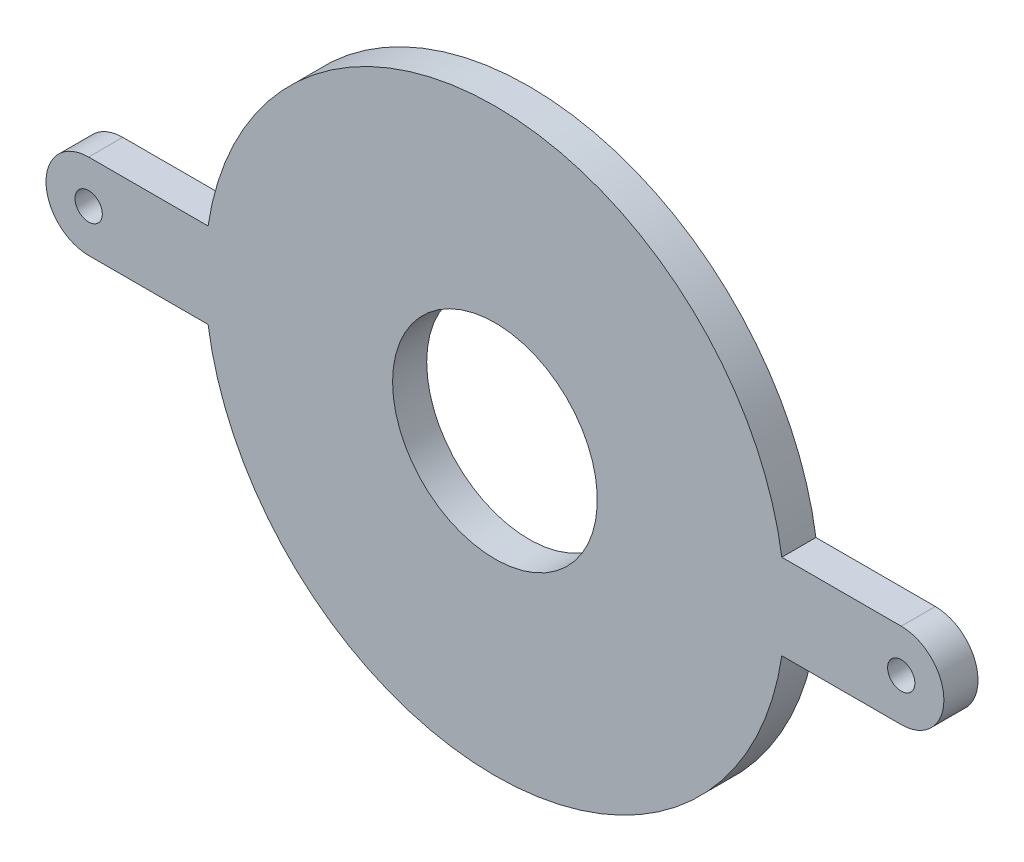
ISO-10303-21;
HEADER;
FILE_DESCRIPTION(('STEP AP214'),'2;1');
FILE_NAME('part.step','',(''),(''),'','','');
FILE_SCHEMA(('AUTOMOTIVE_DESIGN { 1 0 10303 214 1 1 1 1 }'));
ENDSEC;
DATA;
#1=APPLICATION_CONTEXT('core data for automotive mechanical design processes');
#2=APPLICATION_PROTOCOL_DEFINITION('international standard','automotive_design',2000,#1);
#3=PRODUCT_CONTEXT('',#1,'mechanical');
#4=PRODUCT('Part','Part','',(#3));
#5=PRODUCT_RELATED_PRODUCT_CATEGORY('part','',(#4));
#6=PRODUCT_DEFINITION_FORMATION('','',#4);
#7=PRODUCT_DEFINITION_CONTEXT('part definition',#1,'design');
#8=PRODUCT_DEFINITION('design','',#6,#7);
#9=PRODUCT_DEFINITION_SHAPE('','',#8);
#10=(LENGTH_UNIT() NAMED_UNIT(*) SI_UNIT(.MILLI.,.METRE.));
#11=(NAMED_UNIT(*) PLANE_ANGLE_UNIT() SI_UNIT($,.RADIAN.));
#12=(NAMED_UNIT(*) SI_UNIT($,.STERADIAN.) SOLID_ANGLE_UNIT());
#13=UNCERTAINTY_MEASURE_WITH_UNIT(LENGTH_MEASURE(1.E-05),#10,'distance_accuracy_value','');
#14=(GEOMETRIC_REPRESENTATION_CONTEXT(3) GLOBAL_UNCERTAINTY_ASSIGNED_CONTEXT((#13)) GLOBAL_UNIT_ASSIGNED_CONTEXT((#10,
#11,#12)) REPRESENTATION_CONTEXT('',''));
#15=CARTESIAN_POINT('',(0.,0.,0.));
#16=DIRECTION('',(0.,0.,1.));
#17=DIRECTION('',(1.,0.,0.));
#18=AXIS2_PLACEMENT_3D('',#15,#16,#17);
#19=CARTESIAN_POINT('',(0.,0.,-9.5));
#20=DIRECTION('',(0.,0.,1.));
#21=DIRECTION('',(1.,0.,0.));
#22=AXIS2_PLACEMENT_3D('',#19,#20,#21);
#23=CYLINDRICAL_SURFACE('',#22,17.);
#24=DIRECTION('',(0.,0.,-1.));
#25=VECTOR('',#24,1.);
#26=CARTESIAN_POINT('',(-16.8151717208002,2.5,-7.5));
#27=LINE('',#26,#25);
#28=CARTESIAN_POINT('',(-16.8151717208002,2.5,-7.5));
#29=VERTEX_POINT('',#28);
#30=CARTESIAN_POINT('',(-16.8151717208002,2.5,-9.5));
#31=VERTEX_POINT('',#30);
#32=EDGE_CURVE('E192',#29,#31,#27,.T.);
#33=ORIENTED_EDGE('',*,*,#32,.F.);
#34=CARTESIAN_POINT('',(0.,0.,-7.5));
#35=DIRECTION('',(0.,0.,-1.));
#36=DIRECTION('',(-1.,0.,0.));
#37=AXIS2_PLACEMENT_3D('',#34,#35,#36);
#38=CIRCLE('',#37,17.);
#39=CARTESIAN_POINT('',(16.8151717208002,2.5,-7.5));
#40=VERTEX_POINT('',#39);
#41=EDGE_CURVE('E112',#29,#40,#38,.T.);
#42=ORIENTED_EDGE('',*,*,#41,.T.);
#43=DIRECTION('',(0.,0.,-1.));
#44=VECTOR('',#43,1.);
#45=CARTESIAN_POINT('',(16.8151717208002,2.5,-7.5));
#46=LINE('',#45,#44);
#47=CARTESIAN_POINT('',(16.8151717208002,2.5,-9.5));
#48=VERTEX_POINT('',#47);
#49=EDGE_CURVE('E145',#40,#48,#46,.T.);
#50=ORIENTED_EDGE('',*,*,#49,.T.);
#51=CARTESIAN_POINT('',(0.,0.,-9.5));
#52=DIRECTION('',(0.,0.,-1.));
#53=DIRECTION('',(-1.,0.,0.));
#54=AXIS2_PLACEMENT_3D('',#51,#52,#53);
#55=CIRCLE('',#54,17.);
#56=EDGE_CURVE('E45',#31,#48,#55,.T.);
#57=ORIENTED_EDGE('',*,*,#56,.F.);
#58=EDGE_LOOP('',(#33,#42,#50,#57));
#59=FACE_BOUND('',#58,.T.);
#60=ADVANCED_FACE('F37',(#59),#23,.T.);
#61=CARTESIAN_POINT('',(0.,0.,-9.5));
#62=DIRECTION('',(0.,0.,-1.));
#63=DIRECTION('',(-1.,0.,0.));
#64=AXIS2_PLACEMENT_3D('',#61,#62,#63);
#65=PLANE('',#64);
#66=CARTESIAN_POINT('',(-23.8151717208002,0.,-9.5));
#67=DIRECTION('',(0.,0.,-1.));
#68=DIRECTION('',(-1.,0.,0.));
#69=AXIS2_PLACEMENT_3D('',#66,#67,#68);
#70=CIRCLE('',#69,0.799999999999999);
#71=CARTESIAN_POINT('',(-24.6151717208002,0.,-9.5));
#72=VERTEX_POINT('',#71);
#73=EDGE_CURVE('E181',#72,#72,#70,.T.);
#74=ORIENTED_EDGE('',*,*,#73,.F.);
#75=EDGE_LOOP('',(#74));
#76=FACE_BOUND('',#75,.T.);
#77=CARTESIAN_POINT('',(23.8151717208002,0.,-9.5));
#78=DIRECTION('',(0.,0.,-1.));
#79=DIRECTION('',(-1.,0.,0.));
#80=AXIS2_PLACEMENT_3D('',#77,#78,#79);
#81=CIRCLE('',#80,0.799999999999999);
#82=CARTESIAN_POINT('',(23.0151717208002,0.,-9.5));
#83=VERTEX_POINT('',#82);
#84=EDGE_CURVE('E187',#83,#83,#81,.T.);
#85=ORIENTED_EDGE('',*,*,#84,.F.);
#86=EDGE_LOOP('',(#85));
#87=FACE_BOUND('',#86,.T.);
#88=CARTESIAN_POINT('',(16.8151717208002,-2.5,-9.5));
#89=VERTEX_POINT('',#88);
#90=CARTESIAN_POINT('',(-16.8151717208002,-2.5,-9.5));
#91=VERTEX_POINT('',#90);
#92=EDGE_CURVE('E11',#89,#91,#55,.T.);
#93=ORIENTED_EDGE('',*,*,#92,.T.);
#94=DIRECTION('',(-1.,0.,0.));
#95=VECTOR('',#94,1.);
#96=CARTESIAN_POINT('',(-16.8151717208002,-2.5,-9.5));
#97=LINE('',#96,#95);
#98=CARTESIAN_POINT('',(-23.8151717208002,-2.5,-9.5));
#99=VERTEX_POINT('',#98);
#100=EDGE_CURVE('E120',#91,#99,#97,.T.);
#101=ORIENTED_EDGE('',*,*,#100,.T.);
#102=CARTESIAN_POINT('',(-23.8151717208002,0.,-9.5));
#103=DIRECTION('',(0.,0.,-1.));
#104=DIRECTION('',(1.,0.,0.));
#105=AXIS2_PLACEMENT_3D('',#102,#103,#104);
#106=CIRCLE('',#105,2.5);
#107=CARTESIAN_POINT('',(-23.8151717208002,2.5,-9.5));
#108=VERTEX_POINT('',#107);
#109=EDGE_CURVE('E132',#99,#108,#106,.T.);
#110=ORIENTED_EDGE('',*,*,#109,.T.);
#111=DIRECTION('',(1.,0.,0.));
#112=VECTOR('',#111,1.);
#113=CARTESIAN_POINT('',(-16.8151717208002,2.5,-9.5));
#114=LINE('',#113,#112);
#115=EDGE_CURVE('E52',#108,#31,#114,.T.);
#116=ORIENTED_EDGE('',*,*,#115,.T.);
#117=ORIENTED_EDGE('',*,*,#56,.T.);
#118=DIRECTION('',(1.,0.,0.));
#119=VECTOR('',#118,1.);
#120=CARTESIAN_POINT('',(16.8151717208002,2.5,-9.5));
#121=LINE('',#120,#119);
#122=CARTESIAN_POINT('',(23.8151717208002,2.5,-9.5));
#123=VERTEX_POINT('',#122);
#124=EDGE_CURVE('E146',#48,#123,#121,.T.);
#125=ORIENTED_EDGE('',*,*,#124,.T.);
#126=CARTESIAN_POINT('',(23.8151717208002,0.,-9.5));
#127=DIRECTION('',(0.,0.,-1.));
#128=DIRECTION('',(-1.,0.,0.));
#129=AXIS2_PLACEMENT_3D('',#126,#127,#128);
#130=CIRCLE('',#129,2.5);
#131=CARTESIAN_POINT('',(23.8151717208002,-2.5,-9.5));
#132=VERTEX_POINT('',#131);
#133=EDGE_CURVE('E149',#123,#132,#130,.T.);
#134=ORIENTED_EDGE('',*,*,#133,.T.);
#135=DIRECTION('',(-1.,0.,0.));
#136=VECTOR('',#135,1.);
#137=CARTESIAN_POINT('',(16.8151717208002,-2.5,-9.5));
#138=LINE('',#137,#136);
#139=EDGE_CURVE('E58',#132,#89,#138,.T.);
#140=ORIENTED_EDGE('',*,*,#139,.T.);
#141=EDGE_LOOP('',(#93,#101,#110,#116,#117,#125,#134,#140));
#142=FACE_BOUND('',#141,.T.);
#143=CARTESIAN_POINT('',(0.,0.,-9.5));
#144=DIRECTION('',(0.,0.,-1.));
#145=DIRECTION('',(-1.,0.,0.));
#146=AXIS2_PLACEMENT_3D('',#143,#144,#145);
#147=CIRCLE('',#146,6.);
#148=CARTESIAN_POINT('',(-6.,0.,-9.5));
#149=VERTEX_POINT('',#148);
#150=EDGE_CURVE('E175',#149,#149,#147,.T.);
#151=ORIENTED_EDGE('',*,*,#150,.F.);
#152=EDGE_LOOP('',(#151));
#153=FACE_BOUND('',#152,.T.);
#154=ADVANCED_FACE('F169',(#76,#87,#142,#153),#65,.T.);
#155=DIRECTION('',(0.,0.,-1.));
#156=VECTOR('',#155,1.);
#157=CARTESIAN_POINT('',(16.8151717208002,-2.5,-7.5));
#158=LINE('',#157,#156);
#159=CARTESIAN_POINT('',(16.8151717208002,-2.5,-7.5));
#160=VERTEX_POINT('',#159);
#161=EDGE_CURVE('E107',#160,#89,#158,.T.);
#162=ORIENTED_EDGE('',*,*,#161,.F.);
#163=CARTESIAN_POINT('',(-16.8151717208002,-2.5,-7.5));
#164=VERTEX_POINT('',#163);
#165=EDGE_CURVE('E103',#160,#164,#38,.T.);
#166=ORIENTED_EDGE('',*,*,#165,.T.);
#167=DIRECTION('',(0.,0.,-1.));
#168=VECTOR('',#167,1.);
#169=CARTESIAN_POINT('',(-16.8151717208002,-2.5,-7.5));
#170=LINE('',#169,#168);
#171=EDGE_CURVE('E106',#164,#91,#170,.T.);
#172=ORIENTED_EDGE('',*,*,#171,.T.);
#173=ORIENTED_EDGE('',*,*,#92,.F.);
#174=EDGE_LOOP('',(#162,#166,#172,#173));
#175=FACE_BOUND('',#174,.T.);
#176=ADVANCED_FACE('F39',(#175),#23,.T.);
#177=CARTESIAN_POINT('',(16.8151717208002,-2.5,-7.5));
#178=DIRECTION('',(0.,-1.,0.));
#179=DIRECTION('',(1.,0.,0.));
#180=AXIS2_PLACEMENT_3D('',#177,#178,#179);
#181=PLANE('',#180);
#182=ORIENTED_EDGE('',*,*,#139,.F.);
#183=DIRECTION('',(0.,0.,-1.));
#184=VECTOR('',#183,1.);
#185=CARTESIAN_POINT('',(23.8151717208002,-2.5,-7.5));
#186=LINE('',#185,#184);
#187=CARTESIAN_POINT('',(23.8151717208002,-2.5,-7.5));
#188=VERTEX_POINT('',#187);
#189=EDGE_CURVE('E153',#188,#132,#186,.T.);
#190=ORIENTED_EDGE('',*,*,#189,.F.);
#191=DIRECTION('',(-1.,0.,0.));
#192=VECTOR('',#191,1.);
#193=CARTESIAN_POINT('',(16.8151717208002,-2.5,-7.5));
#194=LINE('',#193,#192);
#195=EDGE_CURVE('E143',#188,#160,#194,.T.);
#196=ORIENTED_EDGE('',*,*,#195,.T.);
#197=ORIENTED_EDGE('',*,*,#161,.T.);
#198=EDGE_LOOP('',(#182,#190,#196,#197));
#199=FACE_BOUND('',#198,.T.);
#200=ADVANCED_FACE('F217',(#199),#181,.T.);
#201=CARTESIAN_POINT('',(23.8151717208002,0.,-7.5));
#202=DIRECTION('',(0.,0.,-1.));
#203=DIRECTION('',(-1.,0.,0.));
#204=AXIS2_PLACEMENT_3D('',#201,#202,#203);
#205=CYLINDRICAL_SURFACE('',#204,2.5);
#206=ORIENTED_EDGE('',*,*,#133,.F.);
#207=DIRECTION('',(0.,0.,-1.));
#208=VECTOR('',#207,1.);
#209=CARTESIAN_POINT('',(23.8151717208002,2.5,-7.5));
#210=LINE('',#209,#208);
#211=CARTESIAN_POINT('',(23.8151717208002,2.5,-7.5));
#212=VERTEX_POINT('',#211);
#213=EDGE_CURVE('E155',#212,#123,#210,.T.);
#214=ORIENTED_EDGE('',*,*,#213,.F.);
#215=CARTESIAN_POINT('',(23.8151717208002,0.,-7.5));
#216=DIRECTION('',(0.,0.,-1.));
#217=DIRECTION('',(-1.,0.,0.));
#218=AXIS2_PLACEMENT_3D('',#215,#216,#217);
#219=CIRCLE('',#218,2.5);
#220=EDGE_CURVE('E140',#212,#188,#219,.T.);
#221=ORIENTED_EDGE('',*,*,#220,.T.);
#222=ORIENTED_EDGE('',*,*,#189,.T.);
#223=EDGE_LOOP('',(#206,#214,#221,#222));
#224=FACE_BOUND('',#223,.T.);
#225=ADVANCED_FACE('F168',(#224),#205,.T.);
#226=CARTESIAN_POINT('',(16.8151717208002,2.5,-7.5));
#227=DIRECTION('',(0.,1.,0.));
#228=DIRECTION('',(-1.,0.,0.));
#229=AXIS2_PLACEMENT_3D('',#226,#227,#228);
#230=PLANE('',#229);
#231=ORIENTED_EDGE('',*,*,#124,.F.);
#232=ORIENTED_EDGE('',*,*,#49,.F.);
#233=DIRECTION('',(1.,0.,0.));
#234=VECTOR('',#233,1.);
#235=CARTESIAN_POINT('',(16.8151717208002,2.5,-7.5));
#236=LINE('',#235,#234);
#237=EDGE_CURVE('E137',#40,#212,#236,.T.);
#238=ORIENTED_EDGE('',*,*,#237,.T.);
#239=ORIENTED_EDGE('',*,*,#213,.T.);
#240=EDGE_LOOP('',(#231,#232,#238,#239));
#241=FACE_BOUND('',#240,.T.);
#242=ADVANCED_FACE('F163',(#241),#230,.T.);
#243=CARTESIAN_POINT('',(0.,0.,-7.5));
#244=DIRECTION('',(0.,0.,-1.));
#245=DIRECTION('',(-1.,0.,0.));
#246=AXIS2_PLACEMENT_3D('',#243,#244,#245);
#247=PLANE('',#246);
#248=CARTESIAN_POINT('',(23.8151717208002,0.,-7.5));
#249=DIRECTION('',(0.,0.,-1.));
#250=DIRECTION('',(-1.,0.,0.));
#251=AXIS2_PLACEMENT_3D('',#248,#249,#250);
#252=CIRCLE('',#251,0.799999999999999);
#253=CARTESIAN_POINT('',(23.0151717208002,0.,-7.5));
#254=VERTEX_POINT('',#253);
#255=EDGE_CURVE('E190',#254,#254,#252,.T.);
#256=ORIENTED_EDGE('',*,*,#255,.T.);
#257=EDGE_LOOP('',(#256));
#258=FACE_BOUND('',#257,.T.);
#259=ORIENTED_EDGE('',*,*,#237,.F.);
#260=ORIENTED_EDGE('',*,*,#41,.F.);
#261=DIRECTION('',(1.,0.,0.));
#262=VECTOR('',#261,1.);
#263=CARTESIAN_POINT('',(-16.8151717208002,2.5,-7.5));
#264=LINE('',#263,#262);
#265=CARTESIAN_POINT('',(-23.8151717208002,2.5,-7.5));
#266=VERTEX_POINT('',#265);
#267=EDGE_CURVE('E121',#266,#29,#264,.T.);
#268=ORIENTED_EDGE('',*,*,#267,.F.);
#269=CARTESIAN_POINT('',(-23.8151717208002,0.,-7.5));
#270=DIRECTION('',(0.,0.,-1.));
#271=DIRECTION('',(1.,0.,0.));
#272=AXIS2_PLACEMENT_3D('',#269,#270,#271);
#273=CIRCLE('',#272,2.5);
#274=CARTESIAN_POINT('',(-23.8151717208002,-2.5,-7.5));
#275=VERTEX_POINT('',#274);
#276=EDGE_CURVE('E130',#275,#266,#273,.T.);
#277=ORIENTED_EDGE('',*,*,#276,.F.);
#278=DIRECTION('',(-1.,0.,0.));
#279=VECTOR('',#278,1.);
#280=CARTESIAN_POINT('',(-16.8151717208002,-2.5,-7.5));
#281=LINE('',#280,#279);
#282=EDGE_CURVE('E118',#164,#275,#281,.T.);
#283=ORIENTED_EDGE('',*,*,#282,.F.);
#284=ORIENTED_EDGE('',*,*,#165,.F.);
#285=ORIENTED_EDGE('',*,*,#195,.F.);
#286=ORIENTED_EDGE('',*,*,#220,.F.);
#287=EDGE_LOOP('',(#259,#260,#268,#277,#283,#284,#285,#286));
#288=FACE_BOUND('',#287,.T.);
#289=CARTESIAN_POINT('',(-23.8151717208002,0.,-7.5));
#290=DIRECTION('',(0.,0.,-1.));
#291=DIRECTION('',(-1.,0.,0.));
#292=AXIS2_PLACEMENT_3D('',#289,#290,#291);
#293=CIRCLE('',#292,0.799999999999999);
#294=CARTESIAN_POINT('',(-24.6151717208002,0.,-7.5));
#295=VERTEX_POINT('',#294);
#296=EDGE_CURVE('E184',#295,#295,#293,.T.);
#297=ORIENTED_EDGE('',*,*,#296,.T.);
#298=EDGE_LOOP('',(#297));
#299=FACE_BOUND('',#298,.T.);
#300=CARTESIAN_POINT('',(0.,0.,-7.5));
#301=DIRECTION('',(0.,0.,-1.));
#302=DIRECTION('',(-1.,0.,0.));
#303=AXIS2_PLACEMENT_3D('',#300,#301,#302);
#304=CIRCLE('',#303,6.);
#305=CARTESIAN_POINT('',(-6.,0.,-7.5));
#306=VERTEX_POINT('',#305);
#307=EDGE_CURVE('E113',#306,#306,#304,.F.);
#308=ORIENTED_EDGE('',*,*,#307,.F.);
#309=EDGE_LOOP('',(#308));
#310=FACE_BOUND('',#309,.T.);
#311=ADVANCED_FACE('F126',(#258,#288,#299,#310),#247,.F.);
#312=CARTESIAN_POINT('',(-16.8151717208002,2.5,-7.5));
#313=DIRECTION('',(0.,1.,0.));
#314=DIRECTION('',(-1.,0.,0.));
#315=AXIS2_PLACEMENT_3D('',#312,#313,#314);
#316=PLANE('',#315);
#317=ORIENTED_EDGE('',*,*,#115,.F.);
#318=DIRECTION('',(0.,0.,-1.));
#319=VECTOR('',#318,1.);
#320=CARTESIAN_POINT('',(-23.8151717208002,2.5,-7.5));
#321=LINE('',#320,#319);
#322=EDGE_CURVE('E195',#266,#108,#321,.T.);
#323=ORIENTED_EDGE('',*,*,#322,.F.);
#324=ORIENTED_EDGE('',*,*,#267,.T.);
#325=ORIENTED_EDGE('',*,*,#32,.T.);
#326=EDGE_LOOP('',(#317,#323,#324,#325));
#327=FACE_BOUND('',#326,.T.);
#328=ADVANCED_FACE('F200',(#327),#316,.T.);
#329=CARTESIAN_POINT('',(-23.8151717208002,0.,-7.5));
#330=DIRECTION('',(0.,0.,-1.));
#331=DIRECTION('',(-1.,0.,0.));
#332=AXIS2_PLACEMENT_3D('',#329,#330,#331);
#333=CYLINDRICAL_SURFACE('',#332,2.5);
#334=ORIENTED_EDGE('',*,*,#109,.F.);
#335=DIRECTION('',(0.,0.,-1.));
#336=VECTOR('',#335,1.);
#337=CARTESIAN_POINT('',(-23.8151717208002,-2.5,-7.5));
#338=LINE('',#337,#336);
#339=EDGE_CURVE('E122',#275,#99,#338,.T.);
#340=ORIENTED_EDGE('',*,*,#339,.F.);
#341=ORIENTED_EDGE('',*,*,#276,.T.);
#342=ORIENTED_EDGE('',*,*,#322,.T.);
#343=EDGE_LOOP('',(#334,#340,#341,#342));
#344=FACE_BOUND('',#343,.T.);
#345=ADVANCED_FACE('F203',(#344),#333,.T.);
#346=CARTESIAN_POINT('',(-16.8151717208002,-2.5,-7.5));
#347=DIRECTION('',(0.,-1.,0.));
#348=DIRECTION('',(1.,0.,0.));
#349=AXIS2_PLACEMENT_3D('',#346,#347,#348);
#350=PLANE('',#349);
#351=ORIENTED_EDGE('',*,*,#100,.F.);
#352=ORIENTED_EDGE('',*,*,#171,.F.);
#353=ORIENTED_EDGE('',*,*,#282,.T.);
#354=ORIENTED_EDGE('',*,*,#339,.T.);
#355=EDGE_LOOP('',(#351,#352,#353,#354));
#356=FACE_BOUND('',#355,.T.);
#357=ADVANCED_FACE('F117',(#356),#350,.T.);
#358=CARTESIAN_POINT('',(23.8151717208002,0.,-9.5));
#359=DIRECTION('',(0.,0.,-1.));
#360=DIRECTION('',(-1.,0.,0.));
#361=AXIS2_PLACEMENT_3D('',#358,#359,#360);
#362=CYLINDRICAL_SURFACE('',#361,0.799999999999999);
#363=ORIENTED_EDGE('',*,*,#255,.F.);
#364=EDGE_LOOP('',(#363));
#365=FACE_BOUND('',#364,.T.);
#366=ORIENTED_EDGE('',*,*,#84,.T.);
#367=EDGE_LOOP('',(#366));
#368=FACE_BOUND('',#367,.T.);
#369=ADVANCED_FACE('F210',(#365,#368),#362,.F.);
#370=CARTESIAN_POINT('',(-23.8151717208002,0.,-9.5));
#371=DIRECTION('',(0.,0.,-1.));
#372=DIRECTION('',(-1.,0.,0.));
#373=AXIS2_PLACEMENT_3D('',#370,#371,#372);
#374=CYLINDRICAL_SURFACE('',#373,0.799999999999999);
#375=ORIENTED_EDGE('',*,*,#296,.F.);
#376=EDGE_LOOP('',(#375));
#377=FACE_BOUND('',#376,.T.);
#378=ORIENTED_EDGE('',*,*,#73,.T.);
#379=EDGE_LOOP('',(#378));
#380=FACE_BOUND('',#379,.T.);
#381=ADVANCED_FACE('F240',(#377,#380),#374,.F.);
#382=CARTESIAN_POINT('',(0.,0.,34.9264068711929));
#383=DIRECTION('',(0.,0.,-1.));
#384=DIRECTION('',(-1.,0.,0.));
#385=AXIS2_PLACEMENT_3D('',#382,#383,#384);
#386=CYLINDRICAL_SURFACE('',#385,6.);
#387=ORIENTED_EDGE('',*,*,#307,.T.);
#388=EDGE_LOOP('',(#387));
#389=FACE_BOUND('',#388,.T.);
#390=ORIENTED_EDGE('',*,*,#150,.T.);
#391=EDGE_LOOP('',(#390));
#392=FACE_BOUND('',#391,.T.);
#393=ADVANCED_FACE('F247',(#389,#392),#386,.F.);
#394=CLOSED_SHELL('',(#60,#154,#176,#200,#225,#242,#311,#328,#345,#357,#369,#381,#393));
#395=MANIFOLD_SOLID_BREP('B2',#394);
#396=ADVANCED_BREP_SHAPE_REPRESENTATION('',(#18,#395),#14);
#397=SHAPE_DEFINITION_REPRESENTATION(#9,#396);
ENDSEC;
END-ISO-10303-21;
